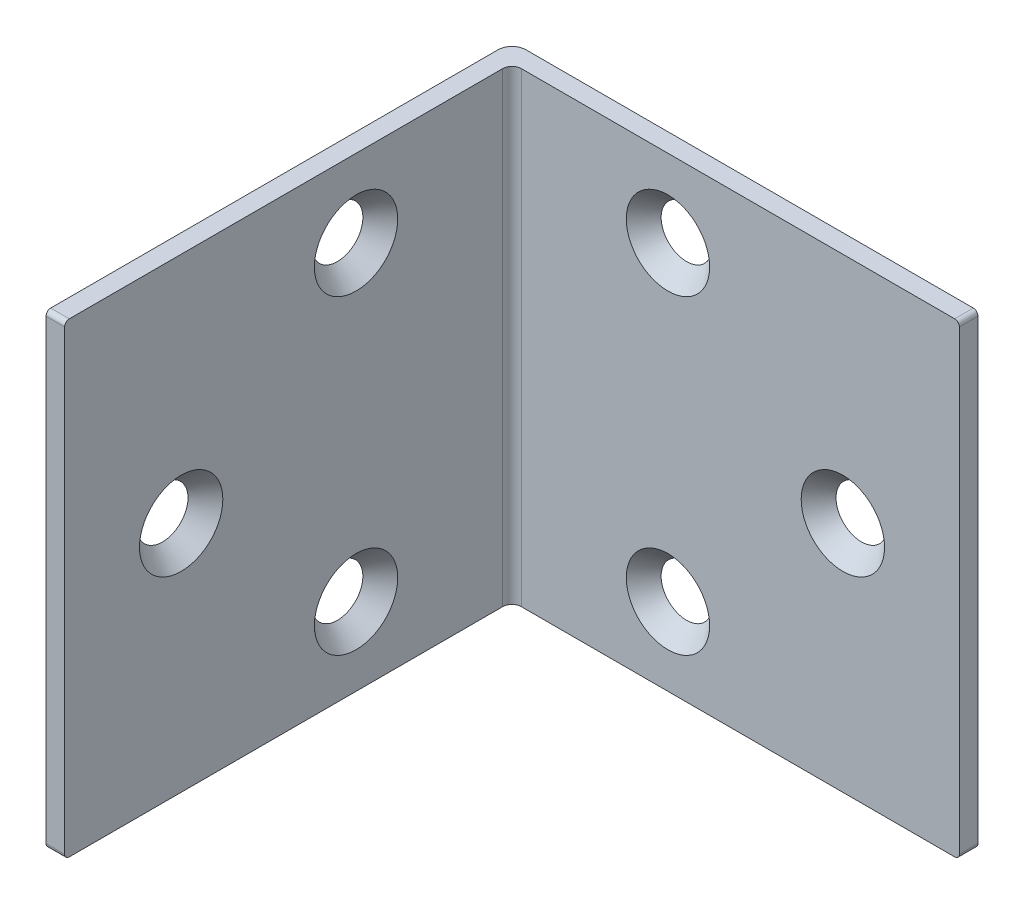
ISO-10303-21;
HEADER;
FILE_DESCRIPTION(('STEP AP214'),'2;1');
FILE_NAME('part.step','',(''),(''),'','','');
FILE_SCHEMA(('AUTOMOTIVE_DESIGN { 1 0 10303 214 1 1 1 1 }'));
ENDSEC;
DATA;
#1=APPLICATION_CONTEXT('core data for automotive mechanical design processes');
#2=APPLICATION_PROTOCOL_DEFINITION('international standard','automotive_design',2000,#1);
#3=PRODUCT_CONTEXT('',#1,'mechanical');
#4=PRODUCT('Part','Part','',(#3));
#5=PRODUCT_RELATED_PRODUCT_CATEGORY('part','',(#4));
#6=PRODUCT_DEFINITION_FORMATION('','',#4);
#7=PRODUCT_DEFINITION_CONTEXT('part definition',#1,'design');
#8=PRODUCT_DEFINITION('design','',#6,#7);
#9=PRODUCT_DEFINITION_SHAPE('','',#8);
#10=(LENGTH_UNIT() NAMED_UNIT(*) SI_UNIT(.MILLI.,.METRE.));
#11=(NAMED_UNIT(*) PLANE_ANGLE_UNIT() SI_UNIT($,.RADIAN.));
#12=(NAMED_UNIT(*) SI_UNIT($,.STERADIAN.) SOLID_ANGLE_UNIT());
#13=UNCERTAINTY_MEASURE_WITH_UNIT(LENGTH_MEASURE(1.E-05),#10,'distance_accuracy_value','');
#14=(GEOMETRIC_REPRESENTATION_CONTEXT(3) GLOBAL_UNCERTAINTY_ASSIGNED_CONTEXT((#13)) GLOBAL_UNIT_ASSIGNED_CONTEXT((#10,
#11,#12)) REPRESENTATION_CONTEXT('',''));
#15=CARTESIAN_POINT('',(0.,0.,0.));
#16=DIRECTION('',(0.,0.,1.));
#17=DIRECTION('',(1.,0.,0.));
#18=AXIS2_PLACEMENT_3D('',#15,#16,#17);
#19=CARTESIAN_POINT('',(0.76200000000001,19.05,37.338));
#20=DIRECTION('',(-1.,0.,0.));
#21=DIRECTION('',(0.,0.,1.));
#22=AXIS2_PLACEMENT_3D('',#19,#20,#21);
#23=PLANE('',#22);
#24=CARTESIAN_POINT('',(0.76200000000001,0.,27.813));
#25=DIRECTION('',(-1.,0.,0.));
#26=DIRECTION('',(0.,0.,1.));
#27=AXIS2_PLACEMENT_3D('',#24,#25,#26);
#28=CIRCLE('',#27,3.40759298843195);
#29=CARTESIAN_POINT('',(0.76200000000001,0.,31.220592988432));
#30=VERTEX_POINT('',#29);
#31=EDGE_CURVE('E225',#30,#30,#28,.T.);
#32=ORIENTED_EDGE('',*,*,#31,.T.);
#33=EDGE_LOOP('',(#32));
#34=FACE_BOUND('',#33,.T.);
#35=CARTESIAN_POINT('',(0.762000000000012,12.7,13.5128));
#36=DIRECTION('',(-1.,0.,0.));
#37=DIRECTION('',(0.,0.,1.));
#38=AXIS2_PLACEMENT_3D('',#35,#36,#37);
#39=CIRCLE('',#38,3.40759298843195);
#40=CARTESIAN_POINT('',(0.762000000000011,12.7,16.920392988432));
#41=VERTEX_POINT('',#40);
#42=EDGE_CURVE('E244',#41,#41,#39,.T.);
#43=ORIENTED_EDGE('',*,*,#42,.T.);
#44=EDGE_LOOP('',(#43));
#45=FACE_BOUND('',#44,.T.);
#46=CARTESIAN_POINT('',(0.762000000000012,-12.7,13.5128));
#47=DIRECTION('',(-1.,0.,0.));
#48=DIRECTION('',(0.,0.,1.));
#49=AXIS2_PLACEMENT_3D('',#46,#47,#48);
#50=CIRCLE('',#49,3.40759298843195);
#51=CARTESIAN_POINT('',(0.762000000000011,-12.7,16.920392988432));
#52=VERTEX_POINT('',#51);
#53=EDGE_CURVE('E237',#52,#52,#50,.T.);
#54=ORIENTED_EDGE('',*,*,#53,.T.);
#55=EDGE_LOOP('',(#54));
#56=FACE_BOUND('',#55,.T.);
#57=DIRECTION('',(0.,-1.,0.));
#58=VECTOR('',#57,1.);
#59=CARTESIAN_POINT('',(0.76200000000001,19.05,37.338));
#60=LINE('',#59,#58);
#61=CARTESIAN_POINT('',(0.76200000000001,18.669,37.338));
#62=VERTEX_POINT('',#61);
#63=CARTESIAN_POINT('',(0.76200000000001,-18.669,37.338));
#64=VERTEX_POINT('',#63);
#65=EDGE_CURVE('E155',#62,#64,#60,.T.);
#66=ORIENTED_EDGE('',*,*,#65,.T.);
#67=CARTESIAN_POINT('',(0.76200000000001,-18.669,36.957));
#68=DIRECTION('',(-1.,0.,0.));
#69=DIRECTION('',(0.,0.,1.));
#70=AXIS2_PLACEMENT_3D('',#67,#68,#69);
#71=CIRCLE('',#70,0.381);
#72=CARTESIAN_POINT('',(0.76200000000001,-19.05,36.957));
#73=VERTEX_POINT('',#72);
#74=EDGE_CURVE('E207',#64,#73,#71,.F.);
#75=ORIENTED_EDGE('',*,*,#74,.T.);
#76=DIRECTION('',(0.,0.,-1.));
#77=VECTOR('',#76,1.);
#78=CARTESIAN_POINT('',(0.76200000000001,-19.05,37.338));
#79=LINE('',#78,#77);
#80=CARTESIAN_POINT('',(0.762000000000013,-19.05,1.52400000000001));
#81=VERTEX_POINT('',#80);
#82=EDGE_CURVE('E222',#73,#81,#79,.T.);
#83=ORIENTED_EDGE('',*,*,#82,.T.);
#84=DIRECTION('',(0.,-1.,0.));
#85=VECTOR('',#84,1.);
#86=CARTESIAN_POINT('',(0.762000000000013,19.05,1.52400000000001));
#87=LINE('',#86,#85);
#88=CARTESIAN_POINT('',(0.762000000000013,19.05,1.52400000000001));
#89=VERTEX_POINT('',#88);
#90=EDGE_CURVE('E171',#81,#89,#87,.F.);
#91=ORIENTED_EDGE('',*,*,#90,.T.);
#92=DIRECTION('',(0.,0.,-1.));
#93=VECTOR('',#92,1.);
#94=CARTESIAN_POINT('',(0.76200000000001,19.05,37.338));
#95=LINE('',#94,#93);
#96=CARTESIAN_POINT('',(0.76200000000001,19.05,36.957));
#97=VERTEX_POINT('',#96);
#98=EDGE_CURVE('E146',#97,#89,#95,.T.);
#99=ORIENTED_EDGE('',*,*,#98,.F.);
#100=CARTESIAN_POINT('',(0.76200000000001,18.669,36.957));
#101=DIRECTION('',(-1.,0.,0.));
#102=DIRECTION('',(0.,0.,1.));
#103=AXIS2_PLACEMENT_3D('',#100,#101,#102);
#104=CIRCLE('',#103,0.381);
#105=EDGE_CURVE('E205',#97,#62,#104,.F.);
#106=ORIENTED_EDGE('',*,*,#105,.T.);
#107=EDGE_LOOP('',(#66,#75,#83,#91,#99,#106));
#108=FACE_BOUND('',#107,.T.);
#109=ADVANCED_FACE('F34',(#34,#45,#56,#108),#23,.F.);
#110=CARTESIAN_POINT('',(0.762000000000014,19.05,0.762000000000013));
#111=DIRECTION('',(0.,0.,-1.));
#112=DIRECTION('',(-1.,0.,0.));
#113=AXIS2_PLACEMENT_3D('',#110,#111,#112);
#114=PLANE('',#113);
#115=CARTESIAN_POINT('',(13.5128,12.7,0.762000000000012));
#116=DIRECTION('',(0.,0.,-1.));
#117=DIRECTION('',(-1.,0.,0.));
#118=AXIS2_PLACEMENT_3D('',#115,#116,#117);
#119=CIRCLE('',#118,3.40759298843193);
#120=CARTESIAN_POINT('',(10.1052070115681,12.7,0.762000000000012));
#121=VERTEX_POINT('',#120);
#122=EDGE_CURVE('E238',#121,#121,#119,.T.);
#123=ORIENTED_EDGE('',*,*,#122,.T.);
#124=EDGE_LOOP('',(#123));
#125=FACE_BOUND('',#124,.T.);
#126=CARTESIAN_POINT('',(13.5128,-12.7,0.762000000000012));
#127=DIRECTION('',(0.,0.,-1.));
#128=DIRECTION('',(-1.,0.,0.));
#129=AXIS2_PLACEMENT_3D('',#126,#127,#128);
#130=CIRCLE('',#129,3.40759298843193);
#131=CARTESIAN_POINT('',(10.1052070115681,-12.7,0.762000000000012));
#132=VERTEX_POINT('',#131);
#133=EDGE_CURVE('E258',#132,#132,#130,.T.);
#134=ORIENTED_EDGE('',*,*,#133,.T.);
#135=EDGE_LOOP('',(#134));
#136=FACE_BOUND('',#135,.T.);
#137=CARTESIAN_POINT('',(27.813,0.,0.762000000000011));
#138=DIRECTION('',(0.,0.,-1.));
#139=DIRECTION('',(-1.,0.,0.));
#140=AXIS2_PLACEMENT_3D('',#137,#138,#139);
#141=CIRCLE('',#140,3.40759298843193);
#142=CARTESIAN_POINT('',(24.4054070115681,0.,0.762000000000012));
#143=VERTEX_POINT('',#142);
#144=EDGE_CURVE('E252',#143,#143,#141,.T.);
#145=ORIENTED_EDGE('',*,*,#144,.T.);
#146=EDGE_LOOP('',(#145));
#147=FACE_BOUND('',#146,.T.);
#148=DIRECTION('',(1.,0.,0.));
#149=VECTOR('',#148,1.);
#150=CARTESIAN_POINT('',(0.762000000000014,-19.05,0.762000000000013));
#151=LINE('',#150,#149);
#152=CARTESIAN_POINT('',(1.52400000000001,-19.05,0.762000000000013));
#153=VERTEX_POINT('',#152);
#154=CARTESIAN_POINT('',(36.957,-19.05,0.762000000000011));
#155=VERTEX_POINT('',#154);
#156=EDGE_CURVE('E151',#153,#155,#151,.T.);
#157=ORIENTED_EDGE('',*,*,#156,.T.);
#158=CARTESIAN_POINT('',(36.957,-18.669,0.762000000000011));
#159=DIRECTION('',(0.,0.,-1.));
#160=DIRECTION('',(-1.,0.,0.));
#161=AXIS2_PLACEMENT_3D('',#158,#159,#160);
#162=CIRCLE('',#161,0.381);
#163=CARTESIAN_POINT('',(37.338,-18.669,0.762000000000011));
#164=VERTEX_POINT('',#163);
#165=EDGE_CURVE('E193',#155,#164,#162,.F.);
#166=ORIENTED_EDGE('',*,*,#165,.T.);
#167=DIRECTION('',(0.,-1.,0.));
#168=VECTOR('',#167,1.);
#169=CARTESIAN_POINT('',(37.338,19.05,0.762000000000011));
#170=LINE('',#169,#168);
#171=CARTESIAN_POINT('',(37.338,18.669,0.762000000000011));
#172=VERTEX_POINT('',#171);
#173=EDGE_CURVE('E140',#172,#164,#170,.T.);
#174=ORIENTED_EDGE('',*,*,#173,.F.);
#175=CARTESIAN_POINT('',(36.957,18.669,0.762000000000011));
#176=DIRECTION('',(0.,0.,-1.));
#177=DIRECTION('',(-1.,0.,0.));
#178=AXIS2_PLACEMENT_3D('',#175,#176,#177);
#179=CIRCLE('',#178,0.381);
#180=CARTESIAN_POINT('',(36.957,19.05,0.762000000000011));
#181=VERTEX_POINT('',#180);
#182=EDGE_CURVE('E191',#172,#181,#179,.F.);
#183=ORIENTED_EDGE('',*,*,#182,.T.);
#184=DIRECTION('',(1.,0.,0.));
#185=VECTOR('',#184,1.);
#186=CARTESIAN_POINT('',(0.762000000000014,19.05,0.762000000000013));
#187=LINE('',#186,#185);
#188=CARTESIAN_POINT('',(1.52400000000001,19.05,0.762000000000013));
#189=VERTEX_POINT('',#188);
#190=EDGE_CURVE('E149',#189,#181,#187,.T.);
#191=ORIENTED_EDGE('',*,*,#190,.F.);
#192=DIRECTION('',(0.,-1.,0.));
#193=VECTOR('',#192,1.);
#194=CARTESIAN_POINT('',(1.52400000000001,-19.05,0.762000000000013));
#195=LINE('',#194,#193);
#196=EDGE_CURVE('E168',#189,#153,#195,.T.);
#197=ORIENTED_EDGE('',*,*,#196,.T.);
#198=EDGE_LOOP('',(#157,#166,#174,#183,#191,#197));
#199=FACE_BOUND('',#198,.T.);
#200=ADVANCED_FACE('F267',(#125,#136,#147,#199),#114,.F.);
#201=CARTESIAN_POINT('',(37.338,19.05,0.762000000000011));
#202=DIRECTION('',(-1.,0.,0.));
#203=DIRECTION('',(0.,0.,1.));
#204=AXIS2_PLACEMENT_3D('',#201,#202,#203);
#205=PLANE('',#204);
#206=ORIENTED_EDGE('',*,*,#173,.T.);
#207=DIRECTION('',(0.,0.,-1.));
#208=VECTOR('',#207,1.);
#209=CARTESIAN_POINT('',(37.338,-18.669,-0.762000000000002));
#210=LINE('',#209,#208);
#211=CARTESIAN_POINT('',(37.338,-18.669,-0.762000000000002));
#212=VERTEX_POINT('',#211);
#213=EDGE_CURVE('E181',#164,#212,#210,.T.);
#214=ORIENTED_EDGE('',*,*,#213,.T.);
#215=DIRECTION('',(0.,-1.,0.));
#216=VECTOR('',#215,1.);
#217=CARTESIAN_POINT('',(37.338,19.05,-0.762000000000002));
#218=LINE('',#217,#216);
#219=CARTESIAN_POINT('',(37.338,18.669,-0.762000000000002));
#220=VERTEX_POINT('',#219);
#221=EDGE_CURVE('E160',#220,#212,#218,.T.);
#222=ORIENTED_EDGE('',*,*,#221,.F.);
#223=DIRECTION('',(0.,0.,-1.));
#224=VECTOR('',#223,1.);
#225=CARTESIAN_POINT('',(37.338,18.669,0.762000000000011));
#226=LINE('',#225,#224);
#227=EDGE_CURVE('E179',#220,#172,#226,.F.);
#228=ORIENTED_EDGE('',*,*,#227,.T.);
#229=EDGE_LOOP('',(#206,#214,#222,#228));
#230=FACE_BOUND('',#229,.T.);
#231=ADVANCED_FACE('F288',(#230),#205,.F.);
#232=CARTESIAN_POINT('',(37.338,19.05,-0.762000000000002));
#233=DIRECTION('',(0.,0.,1.));
#234=DIRECTION('',(1.,0.,0.));
#235=AXIS2_PLACEMENT_3D('',#232,#233,#234);
#236=PLANE('',#235);
#237=CARTESIAN_POINT('',(13.5128,12.7,-0.761999999999989));
#238=DIRECTION('',(0.,0.,1.));
#239=DIRECTION('',(1.,0.,0.));
#240=AXIS2_PLACEMENT_3D('',#237,#238,#239);
#241=CIRCLE('',#240,2.0828);
#242=CARTESIAN_POINT('',(15.5956,12.7,-0.761999999999989));
#243=VERTEX_POINT('',#242);
#244=EDGE_CURVE('E261',#243,#243,#241,.T.);
#245=ORIENTED_EDGE('',*,*,#244,.T.);
#246=EDGE_LOOP('',(#245));
#247=FACE_BOUND('',#246,.T.);
#248=CARTESIAN_POINT('',(13.5128,-12.7,-0.761999999999989));
#249=DIRECTION('',(0.,0.,1.));
#250=DIRECTION('',(1.,0.,0.));
#251=AXIS2_PLACEMENT_3D('',#248,#249,#250);
#252=CIRCLE('',#251,2.0828);
#253=CARTESIAN_POINT('',(15.5956,-12.7,-0.761999999999989));
#254=VERTEX_POINT('',#253);
#255=EDGE_CURVE('E255',#254,#254,#252,.T.);
#256=ORIENTED_EDGE('',*,*,#255,.T.);
#257=EDGE_LOOP('',(#256));
#258=FACE_BOUND('',#257,.T.);
#259=CARTESIAN_POINT('',(27.813,0.,-0.761999999999989));
#260=DIRECTION('',(0.,0.,1.));
#261=DIRECTION('',(1.,0.,0.));
#262=AXIS2_PLACEMENT_3D('',#259,#260,#261);
#263=CIRCLE('',#262,2.0828);
#264=CARTESIAN_POINT('',(29.8958,0.,-0.761999999999989));
#265=VERTEX_POINT('',#264);
#266=EDGE_CURVE('E249',#265,#265,#263,.T.);
#267=ORIENTED_EDGE('',*,*,#266,.T.);
#268=EDGE_LOOP('',(#267));
#269=FACE_BOUND('',#268,.T.);
#270=ORIENTED_EDGE('',*,*,#221,.T.);
#271=CARTESIAN_POINT('',(36.957,-18.669,-0.762000000000002));
#272=DIRECTION('',(0.,0.,1.));
#273=DIRECTION('',(1.,0.,0.));
#274=AXIS2_PLACEMENT_3D('',#271,#272,#273);
#275=CIRCLE('',#274,0.381);
#276=CARTESIAN_POINT('',(36.957,-19.05,-0.762000000000002));
#277=VERTEX_POINT('',#276);
#278=EDGE_CURVE('E186',#212,#277,#275,.F.);
#279=ORIENTED_EDGE('',*,*,#278,.T.);
#280=DIRECTION('',(-1.,0.,0.));
#281=VECTOR('',#280,1.);
#282=CARTESIAN_POINT('',(37.338,-19.05,-0.762000000000002));
#283=LINE('',#282,#281);
#284=CARTESIAN_POINT('',(0.380999999999992,-19.05,-0.761999999999989));
#285=VERTEX_POINT('',#284);
#286=EDGE_CURVE('E147',#277,#285,#283,.T.);
#287=ORIENTED_EDGE('',*,*,#286,.T.);
#288=DIRECTION('',(0.,-1.,0.));
#289=VECTOR('',#288,1.);
#290=CARTESIAN_POINT('',(0.380999999999992,19.05,-0.761999999999989));
#291=LINE('',#290,#289);
#292=CARTESIAN_POINT('',(0.380999999999992,19.05,-0.761999999999989));
#293=VERTEX_POINT('',#292);
#294=EDGE_CURVE('E130',#285,#293,#291,.F.);
#295=ORIENTED_EDGE('',*,*,#294,.T.);
#296=DIRECTION('',(-1.,0.,0.));
#297=VECTOR('',#296,1.);
#298=CARTESIAN_POINT('',(37.338,19.05,-0.762000000000002));
#299=LINE('',#298,#297);
#300=CARTESIAN_POINT('',(36.957,19.05,-0.762000000000002));
#301=VERTEX_POINT('',#300);
#302=EDGE_CURVE('E215',#301,#293,#299,.T.);
#303=ORIENTED_EDGE('',*,*,#302,.F.);
#304=CARTESIAN_POINT('',(36.957,18.669,-0.762000000000002));
#305=DIRECTION('',(0.,0.,1.));
#306=DIRECTION('',(1.,0.,0.));
#307=AXIS2_PLACEMENT_3D('',#304,#305,#306);
#308=CIRCLE('',#307,0.381);
#309=EDGE_CURVE('E184',#301,#220,#308,.F.);
#310=ORIENTED_EDGE('',*,*,#309,.T.);
#311=EDGE_LOOP('',(#270,#279,#287,#295,#303,#310));
#312=FACE_BOUND('',#311,.T.);
#313=ADVANCED_FACE('F335',(#247,#258,#269,#312),#236,.F.);
#314=CARTESIAN_POINT('',(-0.76200000000001,19.05,-0.761999999999988));
#315=DIRECTION('',(1.,0.,0.));
#316=DIRECTION('',(0.,0.,-1.));
#317=AXIS2_PLACEMENT_3D('',#314,#315,#316);
#318=PLANE('',#317);
#319=CARTESIAN_POINT('',(-0.762000000000006,0.,27.813));
#320=DIRECTION('',(1.,0.,0.));
#321=DIRECTION('',(0.,0.,-1.));
#322=AXIS2_PLACEMENT_3D('',#319,#320,#321);
#323=CIRCLE('',#322,2.0828);
#324=CARTESIAN_POINT('',(-0.762000000000007,0.,25.7302));
#325=VERTEX_POINT('',#324);
#326=EDGE_CURVE('E229',#325,#325,#323,.T.);
#327=ORIENTED_EDGE('',*,*,#326,.T.);
#328=EDGE_LOOP('',(#327));
#329=FACE_BOUND('',#328,.T.);
#330=CARTESIAN_POINT('',(-0.762000000000008,12.7,13.5128));
#331=DIRECTION('',(1.,0.,0.));
#332=DIRECTION('',(0.,0.,-1.));
#333=AXIS2_PLACEMENT_3D('',#330,#331,#332);
#334=CIRCLE('',#333,2.0828);
#335=CARTESIAN_POINT('',(-0.762000000000009,12.7,11.43));
#336=VERTEX_POINT('',#335);
#337=EDGE_CURVE('E241',#336,#336,#334,.T.);
#338=ORIENTED_EDGE('',*,*,#337,.T.);
#339=EDGE_LOOP('',(#338));
#340=FACE_BOUND('',#339,.T.);
#341=CARTESIAN_POINT('',(-0.762000000000008,-12.7,13.5128));
#342=DIRECTION('',(1.,0.,0.));
#343=DIRECTION('',(0.,0.,-1.));
#344=AXIS2_PLACEMENT_3D('',#341,#342,#343);
#345=CIRCLE('',#344,2.0828);
#346=CARTESIAN_POINT('',(-0.762000000000009,-12.7,11.43));
#347=VERTEX_POINT('',#346);
#348=EDGE_CURVE('E234',#347,#347,#345,.T.);
#349=ORIENTED_EDGE('',*,*,#348,.T.);
#350=EDGE_LOOP('',(#349));
#351=FACE_BOUND('',#350,.T.);
#352=DIRECTION('',(0.,0.,1.));
#353=VECTOR('',#352,1.);
#354=CARTESIAN_POINT('',(-0.76200000000001,-19.05,-0.761999999999988));
#355=LINE('',#354,#353);
#356=CARTESIAN_POINT('',(-0.76200000000001,-19.05,0.381000000000011));
#357=VERTEX_POINT('',#356);
#358=CARTESIAN_POINT('',(-0.762000000000004,-19.05,36.957));
#359=VERTEX_POINT('',#358);
#360=EDGE_CURVE('E137',#357,#359,#355,.T.);
#361=ORIENTED_EDGE('',*,*,#360,.T.);
#362=CARTESIAN_POINT('',(-0.762000000000004,-18.669,36.957));
#363=DIRECTION('',(1.,0.,0.));
#364=DIRECTION('',(0.,0.,-1.));
#365=AXIS2_PLACEMENT_3D('',#362,#363,#364);
#366=CIRCLE('',#365,0.381);
#367=CARTESIAN_POINT('',(-0.762000000000004,-18.669,37.338));
#368=VERTEX_POINT('',#367);
#369=EDGE_CURVE('E11',#359,#368,#366,.F.);
#370=ORIENTED_EDGE('',*,*,#369,.T.);
#371=DIRECTION('',(0.,-1.,0.));
#372=VECTOR('',#371,1.);
#373=CARTESIAN_POINT('',(-0.762000000000004,19.05,37.338));
#374=LINE('',#373,#372);
#375=CARTESIAN_POINT('',(-0.762000000000004,18.669,37.338));
#376=VERTEX_POINT('',#375);
#377=EDGE_CURVE('E158',#376,#368,#374,.T.);
#378=ORIENTED_EDGE('',*,*,#377,.F.);
#379=CARTESIAN_POINT('',(-0.762000000000004,18.669,36.957));
#380=DIRECTION('',(1.,0.,0.));
#381=DIRECTION('',(0.,0.,-1.));
#382=AXIS2_PLACEMENT_3D('',#379,#380,#381);
#383=CIRCLE('',#382,0.381);
#384=CARTESIAN_POINT('',(-0.762000000000004,19.05,36.957));
#385=VERTEX_POINT('',#384);
#386=EDGE_CURVE('E42',#376,#385,#383,.F.);
#387=ORIENTED_EDGE('',*,*,#386,.T.);
#388=DIRECTION('',(0.,0.,1.));
#389=VECTOR('',#388,1.);
#390=CARTESIAN_POINT('',(-0.76200000000001,19.05,-0.761999999999988));
#391=LINE('',#390,#389);
#392=CARTESIAN_POINT('',(-0.76200000000001,19.05,0.381000000000011));
#393=VERTEX_POINT('',#392);
#394=EDGE_CURVE('E139',#393,#385,#391,.T.);
#395=ORIENTED_EDGE('',*,*,#394,.F.);
#396=DIRECTION('',(0.,-1.,0.));
#397=VECTOR('',#396,1.);
#398=CARTESIAN_POINT('',(-0.76200000000001,19.05,0.381000000000011));
#399=LINE('',#398,#397);
#400=EDGE_CURVE('E128',#393,#357,#399,.T.);
#401=ORIENTED_EDGE('',*,*,#400,.T.);
#402=EDGE_LOOP('',(#361,#370,#378,#387,#395,#401));
#403=FACE_BOUND('',#402,.T.);
#404=ADVANCED_FACE('F136',(#329,#340,#351,#403),#318,.F.);
#405=CARTESIAN_POINT('',(-0.762000000000004,19.05,37.338));
#406=DIRECTION('',(0.,0.,-1.));
#407=DIRECTION('',(-1.,0.,0.));
#408=AXIS2_PLACEMENT_3D('',#405,#406,#407);
#409=PLANE('',#408);
#410=ORIENTED_EDGE('',*,*,#377,.T.);
#411=DIRECTION('',(1.,0.,0.));
#412=VECTOR('',#411,1.);
#413=CARTESIAN_POINT('',(0.76200000000001,-18.669,37.338));
#414=LINE('',#413,#412);
#415=EDGE_CURVE('E202',#368,#64,#414,.T.);
#416=ORIENTED_EDGE('',*,*,#415,.T.);
#417=ORIENTED_EDGE('',*,*,#65,.F.);
#418=DIRECTION('',(1.,0.,0.));
#419=VECTOR('',#418,1.);
#420=CARTESIAN_POINT('',(-0.762000000000004,18.669,37.338));
#421=LINE('',#420,#419);
#422=EDGE_CURVE('E54',#62,#376,#421,.F.);
#423=ORIENTED_EDGE('',*,*,#422,.T.);
#424=EDGE_LOOP('',(#410,#416,#417,#423));
#425=FACE_BOUND('',#424,.T.);
#426=ADVANCED_FACE('F218',(#425),#409,.F.);
#427=CARTESIAN_POINT('',(0.,19.05,0.));
#428=DIRECTION('',(0.,-1.,0.));
#429=DIRECTION('',(0.,0.,-1.));
#430=AXIS2_PLACEMENT_3D('',#427,#428,#429);
#431=PLANE('',#430);
#432=ORIENTED_EDGE('',*,*,#190,.T.);
#433=DIRECTION('',(0.,0.,-1.));
#434=VECTOR('',#433,1.);
#435=CARTESIAN_POINT('',(36.957,19.05,0.));
#436=LINE('',#435,#434);
#437=EDGE_CURVE('E198',#181,#301,#436,.T.);
#438=ORIENTED_EDGE('',*,*,#437,.T.);
#439=ORIENTED_EDGE('',*,*,#302,.T.);
#440=CARTESIAN_POINT('',(0.38099999999999,19.05,0.381000000000011));
#441=DIRECTION('',(0.,-1.,0.));
#442=DIRECTION('',(0.,0.,-1.));
#443=AXIS2_PLACEMENT_3D('',#440,#441,#442);
#444=CIRCLE('',#443,1.143);
#445=EDGE_CURVE('E166',#293,#393,#444,.F.);
#446=ORIENTED_EDGE('',*,*,#445,.T.);
#447=ORIENTED_EDGE('',*,*,#394,.T.);
#448=DIRECTION('',(1.,0.,0.));
#449=VECTOR('',#448,1.);
#450=CARTESIAN_POINT('',(0.,19.05,36.957));
#451=LINE('',#450,#449);
#452=EDGE_CURVE('E195',#385,#97,#451,.T.);
#453=ORIENTED_EDGE('',*,*,#452,.T.);
#454=ORIENTED_EDGE('',*,*,#98,.T.);
#455=CARTESIAN_POINT('',(1.52400000000001,19.05,1.52400000000001));
#456=DIRECTION('',(0.,-1.,0.));
#457=DIRECTION('',(0.,0.,-1.));
#458=AXIS2_PLACEMENT_3D('',#455,#456,#457);
#459=CIRCLE('',#458,0.762);
#460=EDGE_CURVE('E177',#89,#189,#459,.T.);
#461=ORIENTED_EDGE('',*,*,#460,.T.);
#462=EDGE_LOOP('',(#432,#438,#439,#446,#447,#453,#454,#461));
#463=FACE_BOUND('',#462,.T.);
#464=ADVANCED_FACE('F213',(#463),#431,.F.);
#465=CARTESIAN_POINT('',(0.,-19.05,0.));
#466=DIRECTION('',(0.,-1.,0.));
#467=DIRECTION('',(0.,0.,-1.));
#468=AXIS2_PLACEMENT_3D('',#465,#466,#467);
#469=PLANE('',#468);
#470=ORIENTED_EDGE('',*,*,#286,.F.);
#471=DIRECTION('',(0.,0.,-1.));
#472=VECTOR('',#471,1.);
#473=CARTESIAN_POINT('',(36.957,-19.05,0.762000000000011));
#474=LINE('',#473,#472);
#475=EDGE_CURVE('E189',#277,#155,#474,.F.);
#476=ORIENTED_EDGE('',*,*,#475,.T.);
#477=ORIENTED_EDGE('',*,*,#156,.F.);
#478=CARTESIAN_POINT('',(1.52400000000001,-19.05,1.52400000000001));
#479=DIRECTION('',(0.,-1.,0.));
#480=DIRECTION('',(0.,0.,-1.));
#481=AXIS2_PLACEMENT_3D('',#478,#479,#480);
#482=CIRCLE('',#481,0.762);
#483=EDGE_CURVE('E174',#153,#81,#482,.F.);
#484=ORIENTED_EDGE('',*,*,#483,.T.);
#485=ORIENTED_EDGE('',*,*,#82,.F.);
#486=DIRECTION('',(1.,0.,0.));
#487=VECTOR('',#486,1.);
#488=CARTESIAN_POINT('',(-0.762000000000004,-19.05,36.957));
#489=LINE('',#488,#487);
#490=EDGE_CURVE('E145',#73,#359,#489,.F.);
#491=ORIENTED_EDGE('',*,*,#490,.T.);
#492=ORIENTED_EDGE('',*,*,#360,.F.);
#493=CARTESIAN_POINT('',(0.38099999999999,-19.05,0.381000000000011));
#494=DIRECTION('',(0.,-1.,0.));
#495=DIRECTION('',(0.,0.,-1.));
#496=AXIS2_PLACEMENT_3D('',#493,#494,#495);
#497=CIRCLE('',#496,1.143);
#498=EDGE_CURVE('E124',#357,#285,#497,.T.);
#499=ORIENTED_EDGE('',*,*,#498,.T.);
#500=EDGE_LOOP('',(#470,#476,#477,#484,#485,#491,#492,#499));
#501=FACE_BOUND('',#500,.T.);
#502=ADVANCED_FACE('F142',(#501),#469,.T.);
#503=CARTESIAN_POINT('',(0.38099999999999,19.05,0.381000000000011));
#504=DIRECTION('',(0.,-1.,0.));
#505=DIRECTION('',(0.,0.,-1.));
#506=AXIS2_PLACEMENT_3D('',#503,#504,#505);
#507=CYLINDRICAL_SURFACE('',#506,1.143);
#508=ORIENTED_EDGE('',*,*,#445,.F.);
#509=ORIENTED_EDGE('',*,*,#294,.F.);
#510=ORIENTED_EDGE('',*,*,#498,.F.);
#511=ORIENTED_EDGE('',*,*,#400,.F.);
#512=EDGE_LOOP('',(#508,#509,#510,#511));
#513=FACE_BOUND('',#512,.T.);
#514=ADVANCED_FACE('F127',(#513),#507,.T.);
#515=CARTESIAN_POINT('',(1.52400000000001,19.05,1.52400000000001));
#516=DIRECTION('',(0.,1.,0.));
#517=DIRECTION('',(0.,0.,1.));
#518=AXIS2_PLACEMENT_3D('',#515,#516,#517);
#519=CYLINDRICAL_SURFACE('',#518,0.762);
#520=ORIENTED_EDGE('',*,*,#460,.F.);
#521=ORIENTED_EDGE('',*,*,#90,.F.);
#522=ORIENTED_EDGE('',*,*,#483,.F.);
#523=ORIENTED_EDGE('',*,*,#196,.F.);
#524=EDGE_LOOP('',(#520,#521,#522,#523));
#525=FACE_BOUND('',#524,.T.);
#526=ADVANCED_FACE('F295',(#525),#519,.F.);
#527=CARTESIAN_POINT('',(36.957,-18.669,0.762000000000011));
#528=DIRECTION('',(0.,0.,1.));
#529=DIRECTION('',(1.,0.,0.));
#530=AXIS2_PLACEMENT_3D('',#527,#528,#529);
#531=CYLINDRICAL_SURFACE('',#530,0.381);
#532=ORIENTED_EDGE('',*,*,#165,.F.);
#533=ORIENTED_EDGE('',*,*,#475,.F.);
#534=ORIENTED_EDGE('',*,*,#278,.F.);
#535=ORIENTED_EDGE('',*,*,#213,.F.);
#536=EDGE_LOOP('',(#532,#533,#534,#535));
#537=FACE_BOUND('',#536,.T.);
#538=ADVANCED_FACE('F298',(#537),#531,.T.);
#539=CARTESIAN_POINT('',(36.957,18.669,0.));
#540=DIRECTION('',(0.,0.,-1.));
#541=DIRECTION('',(-1.,0.,0.));
#542=AXIS2_PLACEMENT_3D('',#539,#540,#541);
#543=CYLINDRICAL_SURFACE('',#542,0.381);
#544=ORIENTED_EDGE('',*,*,#182,.F.);
#545=ORIENTED_EDGE('',*,*,#227,.F.);
#546=ORIENTED_EDGE('',*,*,#309,.F.);
#547=ORIENTED_EDGE('',*,*,#437,.F.);
#548=EDGE_LOOP('',(#544,#545,#546,#547));
#549=FACE_BOUND('',#548,.T.);
#550=ADVANCED_FACE('F302',(#549),#543,.T.);
#551=CARTESIAN_POINT('',(-0.762000000000004,-18.669,36.957));
#552=DIRECTION('',(-1.,0.,0.));
#553=DIRECTION('',(0.,0.,1.));
#554=AXIS2_PLACEMENT_3D('',#551,#552,#553);
#555=CYLINDRICAL_SURFACE('',#554,0.381);
#556=ORIENTED_EDGE('',*,*,#369,.F.);
#557=ORIENTED_EDGE('',*,*,#490,.F.);
#558=ORIENTED_EDGE('',*,*,#74,.F.);
#559=ORIENTED_EDGE('',*,*,#415,.F.);
#560=EDGE_LOOP('',(#556,#557,#558,#559));
#561=FACE_BOUND('',#560,.T.);
#562=ADVANCED_FACE('F221',(#561),#555,.T.);
#563=CARTESIAN_POINT('',(0.,18.669,36.957));
#564=DIRECTION('',(1.,0.,0.));
#565=DIRECTION('',(0.,0.,-1.));
#566=AXIS2_PLACEMENT_3D('',#563,#564,#565);
#567=CYLINDRICAL_SURFACE('',#566,0.381);
#568=ORIENTED_EDGE('',*,*,#386,.F.);
#569=ORIENTED_EDGE('',*,*,#422,.F.);
#570=ORIENTED_EDGE('',*,*,#105,.F.);
#571=ORIENTED_EDGE('',*,*,#452,.F.);
#572=EDGE_LOOP('',(#568,#569,#570,#571));
#573=FACE_BOUND('',#572,.T.);
#574=ADVANCED_FACE('F36',(#573),#567,.T.);
#575=CARTESIAN_POINT('',(-0.762000000000008,-12.7,13.5128));
#576=DIRECTION('',(1.,0.,0.));
#577=DIRECTION('',(0.,0.,-1.));
#578=AXIS2_PLACEMENT_3D('',#575,#576,#577);
#579=CONICAL_SURFACE('',#578,2.0828,0.715584993317677);
#580=ORIENTED_EDGE('',*,*,#348,.F.);
#581=EDGE_LOOP('',(#580));
#582=FACE_BOUND('',#581,.T.);
#583=ORIENTED_EDGE('',*,*,#53,.F.);
#584=EDGE_LOOP('',(#583));
#585=FACE_BOUND('',#584,.T.);
#586=ADVANCED_FACE('F310',(#582,#585),#579,.F.);
#587=CARTESIAN_POINT('',(-0.762000000000008,12.7,13.5128));
#588=DIRECTION('',(1.,0.,0.));
#589=DIRECTION('',(0.,0.,-1.));
#590=AXIS2_PLACEMENT_3D('',#587,#588,#589);
#591=CONICAL_SURFACE('',#590,2.0828,0.715584993317677);
#592=ORIENTED_EDGE('',*,*,#337,.F.);
#593=EDGE_LOOP('',(#592));
#594=FACE_BOUND('',#593,.T.);
#595=ORIENTED_EDGE('',*,*,#42,.F.);
#596=EDGE_LOOP('',(#595));
#597=FACE_BOUND('',#596,.T.);
#598=ADVANCED_FACE('F314',(#594,#597),#591,.F.);
#599=CARTESIAN_POINT('',(-0.762000000000006,0.,27.813));
#600=DIRECTION('',(1.,0.,0.));
#601=DIRECTION('',(0.,0.,-1.));
#602=AXIS2_PLACEMENT_3D('',#599,#600,#601);
#603=CONICAL_SURFACE('',#602,2.0828,0.715584993317677);
#604=ORIENTED_EDGE('',*,*,#326,.F.);
#605=EDGE_LOOP('',(#604));
#606=FACE_BOUND('',#605,.T.);
#607=ORIENTED_EDGE('',*,*,#31,.F.);
#608=EDGE_LOOP('',(#607));
#609=FACE_BOUND('',#608,.T.);
#610=ADVANCED_FACE('F320',(#606,#609),#603,.F.);
#611=CARTESIAN_POINT('',(27.813,0.,-0.761999999999989));
#612=DIRECTION('',(0.,0.,1.));
#613=DIRECTION('',(1.,0.,0.));
#614=AXIS2_PLACEMENT_3D('',#611,#612,#613);
#615=CONICAL_SURFACE('',#614,2.0828,0.715584993317677);
#616=ORIENTED_EDGE('',*,*,#266,.F.);
#617=EDGE_LOOP('',(#616));
#618=FACE_BOUND('',#617,.T.);
#619=ORIENTED_EDGE('',*,*,#144,.F.);
#620=EDGE_LOOP('',(#619));
#621=FACE_BOUND('',#620,.T.);
#622=ADVANCED_FACE('F278',(#618,#621),#615,.F.);
#623=CARTESIAN_POINT('',(13.5128,-12.7,-0.761999999999989));
#624=DIRECTION('',(0.,0.,1.));
#625=DIRECTION('',(1.,0.,0.));
#626=AXIS2_PLACEMENT_3D('',#623,#624,#625);
#627=CONICAL_SURFACE('',#626,2.0828,0.715584993317677);
#628=ORIENTED_EDGE('',*,*,#255,.F.);
#629=EDGE_LOOP('',(#628));
#630=FACE_BOUND('',#629,.T.);
#631=ORIENTED_EDGE('',*,*,#133,.F.);
#632=EDGE_LOOP('',(#631));
#633=FACE_BOUND('',#632,.T.);
#634=ADVANCED_FACE('F272',(#630,#633),#627,.F.);
#635=CARTESIAN_POINT('',(13.5128,12.7,-0.761999999999989));
#636=DIRECTION('',(0.,0.,1.));
#637=DIRECTION('',(1.,0.,0.));
#638=AXIS2_PLACEMENT_3D('',#635,#636,#637);
#639=CONICAL_SURFACE('',#638,2.0828,0.715584993317677);
#640=ORIENTED_EDGE('',*,*,#244,.F.);
#641=EDGE_LOOP('',(#640));
#642=FACE_BOUND('',#641,.T.);
#643=ORIENTED_EDGE('',*,*,#122,.F.);
#644=EDGE_LOOP('',(#643));
#645=FACE_BOUND('',#644,.T.);
#646=ADVANCED_FACE('F270',(#642,#645),#639,.F.);
#647=CLOSED_SHELL('',(#109,#200,#231,#313,#404,#426,#464,#502,#514,#526,#538,#550,#562,#574,
#586,#598,#610,#622,#634,#646));
#648=MANIFOLD_SOLID_BREP('B2',#647);
#649=ADVANCED_BREP_SHAPE_REPRESENTATION('',(#18,#648),#14);
#650=SHAPE_DEFINITION_REPRESENTATION(#9,#649);
ENDSEC;
END-ISO-10303-21;
